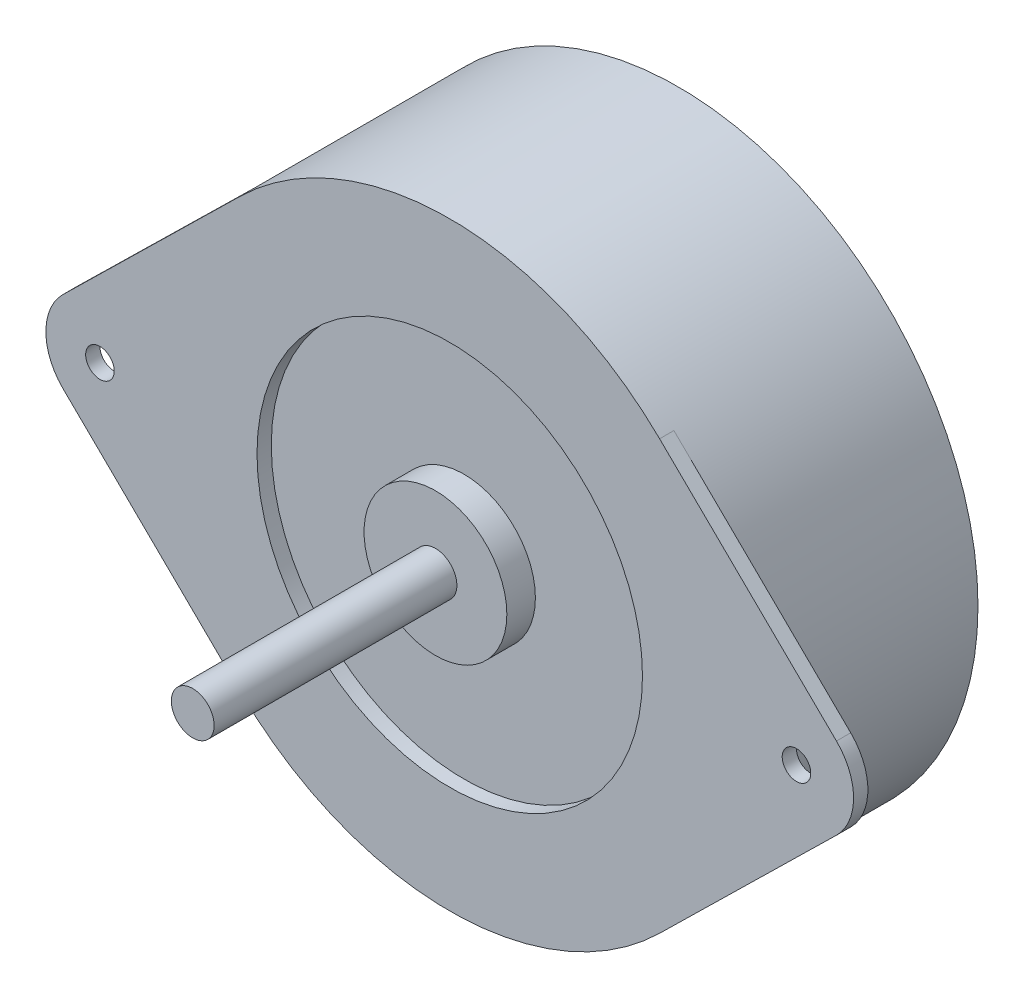
ISO-10303-21;
HEADER;
FILE_DESCRIPTION(('STEP AP214'),'2;1');
FILE_NAME('part.step','',(''),(''),'','','');
FILE_SCHEMA(('AUTOMOTIVE_DESIGN { 1 0 10303 214 1 1 1 1 }'));
ENDSEC;
DATA;
#1=APPLICATION_CONTEXT('core data for automotive mechanical design processes');
#2=APPLICATION_PROTOCOL_DEFINITION('international standard','automotive_design',2000,#1);
#3=PRODUCT_CONTEXT('',#1,'mechanical');
#4=PRODUCT('Part','Part','',(#3));
#5=PRODUCT_RELATED_PRODUCT_CATEGORY('part','',(#4));
#6=PRODUCT_DEFINITION_FORMATION('','',#4);
#7=PRODUCT_DEFINITION_CONTEXT('part definition',#1,'design');
#8=PRODUCT_DEFINITION('design','',#6,#7);
#9=PRODUCT_DEFINITION_SHAPE('','',#8);
#10=(LENGTH_UNIT() NAMED_UNIT(*) SI_UNIT(.MILLI.,.METRE.));
#11=(NAMED_UNIT(*) PLANE_ANGLE_UNIT() SI_UNIT($,.RADIAN.));
#12=(NAMED_UNIT(*) SI_UNIT($,.STERADIAN.) SOLID_ANGLE_UNIT());
#13=UNCERTAINTY_MEASURE_WITH_UNIT(LENGTH_MEASURE(1.E-05),#10,'distance_accuracy_value','');
#14=(GEOMETRIC_REPRESENTATION_CONTEXT(3) GLOBAL_UNCERTAINTY_ASSIGNED_CONTEXT((#13)) GLOBAL_UNIT_ASSIGNED_CONTEXT((#10,
#11,#12)) REPRESENTATION_CONTEXT('',''));
#15=CARTESIAN_POINT('',(0.,0.,0.));
#16=DIRECTION('',(0.,0.,1.));
#17=DIRECTION('',(1.,0.,0.));
#18=AXIS2_PLACEMENT_3D('',#15,#16,#17);
#19=CARTESIAN_POINT('',(0.,0.,2.));
#20=DIRECTION('',(0.,0.,1.));
#21=DIRECTION('',(1.,0.,0.));
#22=AXIS2_PLACEMENT_3D('',#19,#20,#21);
#23=PLANE('',#22);
#24=CARTESIAN_POINT('',(0.,0.,2.));
#25=DIRECTION('',(0.,0.,1.));
#26=DIRECTION('',(1.,0.,0.));
#27=AXIS2_PLACEMENT_3D('',#24,#25,#26);
#28=CIRCLE('',#27,5.);
#29=CARTESIAN_POINT('',(5.,0.,2.));
#30=VERTEX_POINT('',#29);
#31=EDGE_CURVE('E11',#30,#30,#28,.T.);
#32=ORIENTED_EDGE('',*,*,#31,.T.);
#33=EDGE_LOOP('',(#32));
#34=FACE_BOUND('',#33,.T.);
#35=CARTESIAN_POINT('',(0.,0.,2.));
#36=DIRECTION('',(0.,0.,1.));
#37=DIRECTION('',(1.,0.,0.));
#38=AXIS2_PLACEMENT_3D('',#35,#36,#37);
#39=CIRCLE('',#38,1.5);
#40=CARTESIAN_POINT('',(1.5,0.,2.));
#41=VERTEX_POINT('',#40);
#42=EDGE_CURVE('E147',#41,#41,#39,.T.);
#43=ORIENTED_EDGE('',*,*,#42,.F.);
#44=EDGE_LOOP('',(#43));
#45=FACE_BOUND('',#44,.T.);
#46=ADVANCED_FACE('F16',(#34,#45),#23,.T.);
#47=CARTESIAN_POINT('',(0.,0.,2.));
#48=DIRECTION('',(0.,0.,1.));
#49=DIRECTION('',(1.,0.,0.));
#50=AXIS2_PLACEMENT_3D('',#47,#48,#49);
#51=CYLINDRICAL_SURFACE('',#50,1.5);
#52=CARTESIAN_POINT('',(0.,0.,19.));
#53=DIRECTION('',(0.,0.,1.));
#54=DIRECTION('',(1.,0.,0.));
#55=AXIS2_PLACEMENT_3D('',#52,#53,#54);
#56=CIRCLE('',#55,1.5);
#57=CARTESIAN_POINT('',(1.5,0.,19.));
#58=VERTEX_POINT('',#57);
#59=EDGE_CURVE('E23',#58,#58,#56,.T.);
#60=ORIENTED_EDGE('',*,*,#59,.F.);
#61=EDGE_LOOP('',(#60));
#62=FACE_BOUND('',#61,.T.);
#63=ORIENTED_EDGE('',*,*,#42,.T.);
#64=EDGE_LOOP('',(#63));
#65=FACE_BOUND('',#64,.T.);
#66=ADVANCED_FACE('F163',(#62,#65),#51,.T.);
#67=CARTESIAN_POINT('',(0.,0.,0.));
#68=DIRECTION('',(0.,0.,1.));
#69=DIRECTION('',(1.,0.,0.));
#70=AXIS2_PLACEMENT_3D('',#67,#68,#69);
#71=CYLINDRICAL_SURFACE('',#70,5.);
#72=ORIENTED_EDGE('',*,*,#31,.F.);
#73=EDGE_LOOP('',(#72));
#74=FACE_BOUND('',#73,.T.);
#75=CARTESIAN_POINT('',(0.,0.,0.));
#76=DIRECTION('',(0.,0.,1.));
#77=DIRECTION('',(1.,0.,0.));
#78=AXIS2_PLACEMENT_3D('',#75,#76,#77);
#79=CIRCLE('',#78,5.);
#80=CARTESIAN_POINT('',(5.,0.,0.));
#81=VERTEX_POINT('',#80);
#82=EDGE_CURVE('E145',#81,#81,#79,.T.);
#83=ORIENTED_EDGE('',*,*,#82,.T.);
#84=EDGE_LOOP('',(#83));
#85=FACE_BOUND('',#84,.T.);
#86=ADVANCED_FACE('F153',(#74,#85),#71,.T.);
#87=CARTESIAN_POINT('',(0.,0.,19.));
#88=DIRECTION('',(0.,0.,1.));
#89=DIRECTION('',(1.,0.,0.));
#90=AXIS2_PLACEMENT_3D('',#87,#88,#89);
#91=PLANE('',#90);
#92=ORIENTED_EDGE('',*,*,#59,.T.);
#93=EDGE_LOOP('',(#92));
#94=FACE_BOUND('',#93,.T.);
#95=ADVANCED_FACE('F150',(#94),#91,.T.);
#96=CARTESIAN_POINT('',(0.,0.,0.));
#97=DIRECTION('',(0.,0.,1.));
#98=DIRECTION('',(1.,0.,0.));
#99=AXIS2_PLACEMENT_3D('',#96,#97,#98);
#100=PLANE('',#99);
#101=CARTESIAN_POINT('',(0.,0.,0.));
#102=DIRECTION('',(0.,0.,1.));
#103=DIRECTION('',(1.,0.,0.));
#104=AXIS2_PLACEMENT_3D('',#101,#102,#103);
#105=CIRCLE('',#104,13.5);
#106=CARTESIAN_POINT('',(13.5,0.,0.));
#107=VERTEX_POINT('',#106);
#108=EDGE_CURVE('E143',#107,#107,#105,.T.);
#109=ORIENTED_EDGE('',*,*,#108,.T.);
#110=EDGE_LOOP('',(#109));
#111=FACE_BOUND('',#110,.T.);
#112=ORIENTED_EDGE('',*,*,#82,.F.);
#113=EDGE_LOOP('',(#112));
#114=FACE_BOUND('',#113,.T.);
#115=ADVANCED_FACE('F152',(#111,#114),#100,.T.);
#116=CARTESIAN_POINT('',(0.,0.,0.));
#117=DIRECTION('',(0.,0.,1.));
#118=DIRECTION('',(1.,0.,0.));
#119=AXIS2_PLACEMENT_3D('',#116,#117,#118);
#120=CYLINDRICAL_SURFACE('',#119,13.5);
#121=CARTESIAN_POINT('',(0.,0.,1.));
#122=DIRECTION('',(0.,0.,1.));
#123=DIRECTION('',(1.,0.,0.));
#124=AXIS2_PLACEMENT_3D('',#121,#122,#123);
#125=CIRCLE('',#124,13.5);
#126=CARTESIAN_POINT('',(13.5,0.,1.));
#127=VERTEX_POINT('',#126);
#128=EDGE_CURVE('E141',#127,#127,#125,.T.);
#129=ORIENTED_EDGE('',*,*,#128,.T.);
#130=EDGE_LOOP('',(#129));
#131=FACE_BOUND('',#130,.T.);
#132=ORIENTED_EDGE('',*,*,#108,.F.);
#133=EDGE_LOOP('',(#132));
#134=FACE_BOUND('',#133,.T.);
#135=ADVANCED_FACE('F160',(#131,#134),#120,.F.);
#136=CARTESIAN_POINT('',(0.,0.,1.));
#137=DIRECTION('',(0.,0.,1.));
#138=DIRECTION('',(1.,0.,0.));
#139=AXIS2_PLACEMENT_3D('',#136,#137,#138);
#140=PLANE('',#139);
#141=DIRECTION('',(-0.714142842854285,0.7,0.));
#142=VECTOR('',#141,1.);
#143=CARTESIAN_POINT('',(27.0857142857143,2.85657137141714,1.));
#144=LINE('',#143,#142);
#145=CARTESIAN_POINT('',(27.0857142857143,2.85657137141714,1.));
#146=VERTEX_POINT('',#145);
#147=CARTESIAN_POINT('',(14.7,14.99699969994,1.));
#148=VERTEX_POINT('',#147);
#149=EDGE_CURVE('E139',#146,#148,#144,.T.);
#150=ORIENTED_EDGE('',*,*,#149,.T.);
#151=CARTESIAN_POINT('',(0.,0.,1.));
#152=DIRECTION('',(0.,0.,1.));
#153=DIRECTION('',(0.7,0.714142842854285,0.));
#154=AXIS2_PLACEMENT_3D('',#151,#152,#153);
#155=CIRCLE('',#154,21.);
#156=CARTESIAN_POINT('',(-14.7,14.99699969994,1.));
#157=VERTEX_POINT('',#156);
#158=EDGE_CURVE('E130',#148,#157,#155,.T.);
#159=ORIENTED_EDGE('',*,*,#158,.T.);
#160=DIRECTION('',(-0.714142842854285,-0.7,0.));
#161=VECTOR('',#160,1.);
#162=CARTESIAN_POINT('',(-14.7,14.99699969994,1.));
#163=LINE('',#162,#161);
#164=CARTESIAN_POINT('',(-27.0857142857143,2.85657137141714,1.));
#165=VERTEX_POINT('',#164);
#166=EDGE_CURVE('E134',#157,#165,#163,.T.);
#167=ORIENTED_EDGE('',*,*,#166,.T.);
#168=CARTESIAN_POINT('',(-24.2857142857143,0.,1.));
#169=DIRECTION('',(0.,0.,1.));
#170=DIRECTION('',(-0.7,0.714142842854285,0.));
#171=AXIS2_PLACEMENT_3D('',#168,#169,#170);
#172=CIRCLE('',#171,4.);
#173=CARTESIAN_POINT('',(-27.0857142857143,-2.85657137141714,1.));
#174=VERTEX_POINT('',#173);
#175=EDGE_CURVE('E448',#165,#174,#172,.T.);
#176=ORIENTED_EDGE('',*,*,#175,.T.);
#177=DIRECTION('',(0.714142842854285,-0.7,0.));
#178=VECTOR('',#177,1.);
#179=CARTESIAN_POINT('',(-27.0857142857143,-2.85657137141714,1.));
#180=LINE('',#179,#178);
#181=CARTESIAN_POINT('',(-14.7,-14.99699969994,1.));
#182=VERTEX_POINT('',#181);
#183=EDGE_CURVE('E431',#174,#182,#180,.T.);
#184=ORIENTED_EDGE('',*,*,#183,.T.);
#185=CARTESIAN_POINT('',(0.,0.,1.));
#186=DIRECTION('',(0.,0.,1.));
#187=DIRECTION('',(-0.700000000000001,-0.714142842854284,0.));
#188=AXIS2_PLACEMENT_3D('',#185,#186,#187);
#189=CIRCLE('',#188,21.);
#190=CARTESIAN_POINT('',(14.7,-14.99699969994,1.));
#191=VERTEX_POINT('',#190);
#192=EDGE_CURVE('E437',#182,#191,#189,.T.);
#193=ORIENTED_EDGE('',*,*,#192,.T.);
#194=DIRECTION('',(0.714142842854285,0.7,0.));
#195=VECTOR('',#194,1.);
#196=CARTESIAN_POINT('',(14.7,-14.99699969994,1.));
#197=LINE('',#196,#195);
#198=CARTESIAN_POINT('',(27.0857142857143,-2.85657137141714,1.));
#199=VERTEX_POINT('',#198);
#200=EDGE_CURVE('E416',#191,#199,#197,.T.);
#201=ORIENTED_EDGE('',*,*,#200,.T.);
#202=CARTESIAN_POINT('',(24.2857142857143,0.,1.));
#203=DIRECTION('',(0.,0.,1.));
#204=DIRECTION('',(0.7,-0.714142842854285,0.));
#205=AXIS2_PLACEMENT_3D('',#202,#203,#204);
#206=CIRCLE('',#205,4.);
#207=EDGE_CURVE('E407',#199,#146,#206,.T.);
#208=ORIENTED_EDGE('',*,*,#207,.T.);
#209=EDGE_LOOP('',(#150,#159,#167,#176,#184,#193,#201,#208));
#210=FACE_BOUND('',#209,.T.);
#211=ORIENTED_EDGE('',*,*,#128,.F.);
#212=EDGE_LOOP('',(#211));
#213=FACE_BOUND('',#212,.T.);
#214=CARTESIAN_POINT('',(24.2857142857143,0.,1.));
#215=DIRECTION('',(0.,0.,1.));
#216=DIRECTION('',(1.,0.,0.));
#217=AXIS2_PLACEMENT_3D('',#214,#215,#216);
#218=CIRCLE('',#217,1.);
#219=CARTESIAN_POINT('',(25.2857142857143,0.,1.));
#220=VERTEX_POINT('',#219);
#221=EDGE_CURVE('E456',#220,#220,#218,.T.);
#222=ORIENTED_EDGE('',*,*,#221,.F.);
#223=EDGE_LOOP('',(#222));
#224=FACE_BOUND('',#223,.T.);
#225=CARTESIAN_POINT('',(-24.5,0.,1.));
#226=DIRECTION('',(0.,0.,1.));
#227=DIRECTION('',(1.,0.,0.));
#228=AXIS2_PLACEMENT_3D('',#225,#226,#227);
#229=CIRCLE('',#228,1.);
#230=CARTESIAN_POINT('',(-23.5,0.,1.));
#231=VERTEX_POINT('',#230);
#232=EDGE_CURVE('E445',#231,#231,#229,.T.);
#233=ORIENTED_EDGE('',*,*,#232,.F.);
#234=EDGE_LOOP('',(#233));
#235=FACE_BOUND('',#234,.T.);
#236=ADVANCED_FACE('F304',(#210,#213,#224,#235),#140,.T.);
#237=CARTESIAN_POINT('',(27.0857142857143,2.85657137141714,0.));
#238=DIRECTION('',(0.7,0.714142842854285,0.));
#239=DIRECTION('',(-0.714142842854285,0.7,0.));
#240=AXIS2_PLACEMENT_3D('',#237,#238,#239);
#241=PLANE('',#240);
#242=DIRECTION('',(-0.714142842854285,0.7,0.));
#243=VECTOR('',#242,1.);
#244=CARTESIAN_POINT('',(27.0857142857143,2.85657137141714,0.));
#245=LINE('',#244,#243);
#246=CARTESIAN_POINT('',(27.0857142857143,2.85657137141714,0.));
#247=VERTEX_POINT('',#246);
#248=CARTESIAN_POINT('',(14.7,14.99699969994,0.));
#249=VERTEX_POINT('',#248);
#250=EDGE_CURVE('E132',#247,#249,#245,.T.);
#251=ORIENTED_EDGE('',*,*,#250,.T.);
#252=DIRECTION('',(0.,0.,1.));
#253=VECTOR('',#252,1.);
#254=CARTESIAN_POINT('',(14.7,14.99699969994,0.));
#255=LINE('',#254,#253);
#256=EDGE_CURVE('E119',#249,#148,#255,.T.);
#257=ORIENTED_EDGE('',*,*,#256,.T.);
#258=ORIENTED_EDGE('',*,*,#149,.F.);
#259=DIRECTION('',(0.,0.,1.));
#260=VECTOR('',#259,1.);
#261=CARTESIAN_POINT('',(27.0857142857143,2.85657137141714,0.));
#262=LINE('',#261,#260);
#263=EDGE_CURVE('E434',#247,#146,#262,.T.);
#264=ORIENTED_EDGE('',*,*,#263,.F.);
#265=EDGE_LOOP('',(#251,#257,#258,#264));
#266=FACE_BOUND('',#265,.T.);
#267=ADVANCED_FACE('F201',(#266),#241,.T.);
#268=CARTESIAN_POINT('',(0.,0.,-15.));
#269=DIRECTION('',(0.,0.,1.));
#270=DIRECTION('',(1.,0.,0.));
#271=AXIS2_PLACEMENT_3D('',#268,#269,#270);
#272=CYLINDRICAL_SURFACE('',#271,21.);
#273=CARTESIAN_POINT('',(0.,0.,0.));
#274=DIRECTION('',(0.,0.,1.));
#275=DIRECTION('',(0.7,-0.714142842854285,0.));
#276=AXIS2_PLACEMENT_3D('',#273,#274,#275);
#277=CIRCLE('',#276,21.);
#278=CARTESIAN_POINT('',(14.7,-14.99699969994,0.));
#279=VERTEX_POINT('',#278);
#280=CARTESIAN_POINT('',(21.,0.,0.));
#281=VERTEX_POINT('',#280);
#282=EDGE_CURVE('E115',#279,#281,#277,.T.);
#283=ORIENTED_EDGE('',*,*,#282,.F.);
#284=DIRECTION('',(0.,0.,1.));
#285=VECTOR('',#284,1.);
#286=CARTESIAN_POINT('',(14.7,-14.99699969994,0.));
#287=LINE('',#286,#285);
#288=EDGE_CURVE('E452',#279,#191,#287,.T.);
#289=ORIENTED_EDGE('',*,*,#288,.T.);
#290=ORIENTED_EDGE('',*,*,#192,.F.);
#291=DIRECTION('',(0.,0.,1.));
#292=VECTOR('',#291,1.);
#293=CARTESIAN_POINT('',(-14.7,-14.99699969994,0.));
#294=LINE('',#293,#292);
#295=CARTESIAN_POINT('',(-14.7,-14.99699969994,0.));
#296=VERTEX_POINT('',#295);
#297=EDGE_CURVE('E423',#296,#182,#294,.T.);
#298=ORIENTED_EDGE('',*,*,#297,.F.);
#299=CARTESIAN_POINT('',(0.,0.,0.));
#300=DIRECTION('',(0.,0.,1.));
#301=DIRECTION('',(-0.7,0.714142842854285,0.));
#302=AXIS2_PLACEMENT_3D('',#299,#300,#301);
#303=CIRCLE('',#302,21.);
#304=CARTESIAN_POINT('',(-14.7,14.99699969994,0.));
#305=VERTEX_POINT('',#304);
#306=EDGE_CURVE('E400',#305,#296,#303,.T.);
#307=ORIENTED_EDGE('',*,*,#306,.F.);
#308=DIRECTION('',(0.,0.,1.));
#309=VECTOR('',#308,1.);
#310=CARTESIAN_POINT('',(-14.7,14.99699969994,0.));
#311=LINE('',#310,#309);
#312=EDGE_CURVE('E419',#305,#157,#311,.T.);
#313=ORIENTED_EDGE('',*,*,#312,.T.);
#314=ORIENTED_EDGE('',*,*,#158,.F.);
#315=ORIENTED_EDGE('',*,*,#256,.F.);
#316=CARTESIAN_POINT('',(0.,0.,0.));
#317=DIRECTION('',(0.,0.,1.));
#318=DIRECTION('',(1.,0.,0.));
#319=AXIS2_PLACEMENT_3D('',#316,#317,#318);
#320=CIRCLE('',#319,21.);
#321=EDGE_CURVE('E111',#281,#249,#320,.T.);
#322=ORIENTED_EDGE('',*,*,#321,.F.);
#323=EDGE_LOOP('',(#283,#289,#290,#298,#307,#313,#314,#315,#322));
#324=FACE_BOUND('',#323,.T.);
#325=CARTESIAN_POINT('',(0.,0.,-15.));
#326=DIRECTION('',(0.,0.,1.));
#327=DIRECTION('',(1.,0.,0.));
#328=AXIS2_PLACEMENT_3D('',#325,#326,#327);
#329=CIRCLE('',#328,21.);
#330=CARTESIAN_POINT('',(21.,0.,-15.));
#331=VERTEX_POINT('',#330);
#332=EDGE_CURVE('E450',#331,#331,#329,.T.);
#333=ORIENTED_EDGE('',*,*,#332,.T.);
#334=EDGE_LOOP('',(#333));
#335=FACE_BOUND('',#334,.T.);
#336=ADVANCED_FACE('F113',(#324,#335),#272,.T.);
#337=CARTESIAN_POINT('',(-14.7,14.99699969994,0.));
#338=DIRECTION('',(-0.7,0.714142842854285,0.));
#339=DIRECTION('',(-0.714142842854285,-0.7,0.));
#340=AXIS2_PLACEMENT_3D('',#337,#338,#339);
#341=PLANE('',#340);
#342=DIRECTION('',(-0.714142842854285,-0.7,0.));
#343=VECTOR('',#342,1.);
#344=CARTESIAN_POINT('',(-14.7,14.99699969994,0.));
#345=LINE('',#344,#343);
#346=CARTESIAN_POINT('',(-27.0857142857143,2.85657137141714,0.));
#347=VERTEX_POINT('',#346);
#348=EDGE_CURVE('E454',#305,#347,#345,.T.);
#349=ORIENTED_EDGE('',*,*,#348,.T.);
#350=DIRECTION('',(0.,0.,1.));
#351=VECTOR('',#350,1.);
#352=CARTESIAN_POINT('',(-27.0857142857143,2.85657137141714,0.));
#353=LINE('',#352,#351);
#354=EDGE_CURVE('E440',#347,#165,#353,.T.);
#355=ORIENTED_EDGE('',*,*,#354,.T.);
#356=ORIENTED_EDGE('',*,*,#166,.F.);
#357=ORIENTED_EDGE('',*,*,#312,.F.);
#358=EDGE_LOOP('',(#349,#355,#356,#357));
#359=FACE_BOUND('',#358,.T.);
#360=ADVANCED_FACE('F200',(#359),#341,.T.);
#361=CARTESIAN_POINT('',(-24.2857142857143,0.,0.));
#362=DIRECTION('',(0.,0.,1.));
#363=DIRECTION('',(-0.7,0.714142842854285,0.));
#364=AXIS2_PLACEMENT_3D('',#361,#362,#363);
#365=CYLINDRICAL_SURFACE('',#364,4.);
#366=CARTESIAN_POINT('',(-24.2857142857143,0.,0.));
#367=DIRECTION('',(0.,0.,1.));
#368=DIRECTION('',(-0.7,0.714142842854285,0.));
#369=AXIS2_PLACEMENT_3D('',#366,#367,#368);
#370=CIRCLE('',#369,4.);
#371=CARTESIAN_POINT('',(-27.0857142857143,-2.85657137141714,0.));
#372=VERTEX_POINT('',#371);
#373=EDGE_CURVE('E443',#347,#372,#370,.T.);
#374=ORIENTED_EDGE('',*,*,#373,.T.);
#375=DIRECTION('',(0.,0.,1.));
#376=VECTOR('',#375,1.);
#377=CARTESIAN_POINT('',(-27.0857142857143,-2.85657137141714,0.));
#378=LINE('',#377,#376);
#379=EDGE_CURVE('E426',#372,#174,#378,.T.);
#380=ORIENTED_EDGE('',*,*,#379,.T.);
#381=ORIENTED_EDGE('',*,*,#175,.F.);
#382=ORIENTED_EDGE('',*,*,#354,.F.);
#383=EDGE_LOOP('',(#374,#380,#381,#382));
#384=FACE_BOUND('',#383,.T.);
#385=ADVANCED_FACE('F268',(#384),#365,.T.);
#386=CARTESIAN_POINT('',(-27.0857142857143,-2.85657137141714,0.));
#387=DIRECTION('',(-0.7,-0.714142842854285,0.));
#388=DIRECTION('',(0.714142842854285,-0.7,0.));
#389=AXIS2_PLACEMENT_3D('',#386,#387,#388);
#390=PLANE('',#389);
#391=DIRECTION('',(0.714142842854285,-0.7,0.));
#392=VECTOR('',#391,1.);
#393=CARTESIAN_POINT('',(-27.0857142857143,-2.85657137141714,0.));
#394=LINE('',#393,#392);
#395=EDGE_CURVE('E429',#372,#296,#394,.T.);
#396=ORIENTED_EDGE('',*,*,#395,.T.);
#397=ORIENTED_EDGE('',*,*,#297,.T.);
#398=ORIENTED_EDGE('',*,*,#183,.F.);
#399=ORIENTED_EDGE('',*,*,#379,.F.);
#400=EDGE_LOOP('',(#396,#397,#398,#399));
#401=FACE_BOUND('',#400,.T.);
#402=ADVANCED_FACE('F259',(#401),#390,.T.);
#403=CARTESIAN_POINT('',(14.7,-14.99699969994,0.));
#404=DIRECTION('',(0.7,-0.714142842854285,0.));
#405=DIRECTION('',(0.714142842854285,0.7,0.));
#406=AXIS2_PLACEMENT_3D('',#403,#404,#405);
#407=PLANE('',#406);
#408=DIRECTION('',(0.714142842854285,0.7,0.));
#409=VECTOR('',#408,1.);
#410=CARTESIAN_POINT('',(14.7,-14.99699969994,0.));
#411=LINE('',#410,#409);
#412=CARTESIAN_POINT('',(27.0857142857143,-2.85657137141714,0.));
#413=VERTEX_POINT('',#412);
#414=EDGE_CURVE('E129',#279,#413,#411,.T.);
#415=ORIENTED_EDGE('',*,*,#414,.T.);
#416=DIRECTION('',(0.,0.,1.));
#417=VECTOR('',#416,1.);
#418=CARTESIAN_POINT('',(27.0857142857143,-2.85657137141714,0.));
#419=LINE('',#418,#417);
#420=EDGE_CURVE('E410',#413,#199,#419,.T.);
#421=ORIENTED_EDGE('',*,*,#420,.T.);
#422=ORIENTED_EDGE('',*,*,#200,.F.);
#423=ORIENTED_EDGE('',*,*,#288,.F.);
#424=EDGE_LOOP('',(#415,#421,#422,#423));
#425=FACE_BOUND('',#424,.T.);
#426=ADVANCED_FACE('F250',(#425),#407,.T.);
#427=CARTESIAN_POINT('',(24.2857142857143,0.,0.));
#428=DIRECTION('',(0.,0.,1.));
#429=DIRECTION('',(0.7,-0.714142842854285,0.));
#430=AXIS2_PLACEMENT_3D('',#427,#428,#429);
#431=CYLINDRICAL_SURFACE('',#430,4.);
#432=CARTESIAN_POINT('',(24.2857142857143,0.,0.));
#433=DIRECTION('',(0.,0.,1.));
#434=DIRECTION('',(0.7,-0.714142842854285,0.));
#435=AXIS2_PLACEMENT_3D('',#432,#433,#434);
#436=CIRCLE('',#435,4.);
#437=EDGE_CURVE('E413',#413,#247,#436,.T.);
#438=ORIENTED_EDGE('',*,*,#437,.T.);
#439=ORIENTED_EDGE('',*,*,#263,.T.);
#440=ORIENTED_EDGE('',*,*,#207,.F.);
#441=ORIENTED_EDGE('',*,*,#420,.F.);
#442=EDGE_LOOP('',(#438,#439,#440,#441));
#443=FACE_BOUND('',#442,.T.);
#444=ADVANCED_FACE('F238',(#443),#431,.T.);
#445=CARTESIAN_POINT('',(24.2857142857143,0.,0.));
#446=DIRECTION('',(0.,0.,1.));
#447=DIRECTION('',(1.,0.,0.));
#448=AXIS2_PLACEMENT_3D('',#445,#446,#447);
#449=CYLINDRICAL_SURFACE('',#448,1.);
#450=ORIENTED_EDGE('',*,*,#221,.T.);
#451=EDGE_LOOP('',(#450));
#452=FACE_BOUND('',#451,.T.);
#453=CARTESIAN_POINT('',(24.2857142857143,0.,0.));
#454=DIRECTION('',(0.,0.,1.));
#455=DIRECTION('',(1.,0.,0.));
#456=AXIS2_PLACEMENT_3D('',#453,#454,#455);
#457=CIRCLE('',#456,1.);
#458=CARTESIAN_POINT('',(25.2857142857143,0.,0.));
#459=VERTEX_POINT('',#458);
#460=EDGE_CURVE('E122',#459,#459,#457,.T.);
#461=ORIENTED_EDGE('',*,*,#460,.F.);
#462=EDGE_LOOP('',(#461));
#463=FACE_BOUND('',#462,.T.);
#464=ADVANCED_FACE('F231',(#452,#463),#449,.F.);
#465=CARTESIAN_POINT('',(-24.5,0.,0.));
#466=DIRECTION('',(0.,0.,1.));
#467=DIRECTION('',(1.,0.,0.));
#468=AXIS2_PLACEMENT_3D('',#465,#466,#467);
#469=CYLINDRICAL_SURFACE('',#468,1.);
#470=ORIENTED_EDGE('',*,*,#232,.T.);
#471=EDGE_LOOP('',(#470));
#472=FACE_BOUND('',#471,.T.);
#473=CARTESIAN_POINT('',(-24.5,0.,0.));
#474=DIRECTION('',(0.,0.,1.));
#475=DIRECTION('',(1.,0.,0.));
#476=AXIS2_PLACEMENT_3D('',#473,#474,#475);
#477=CIRCLE('',#476,1.);
#478=CARTESIAN_POINT('',(-23.5,0.,0.));
#479=VERTEX_POINT('',#478);
#480=EDGE_CURVE('E123',#479,#479,#477,.T.);
#481=ORIENTED_EDGE('',*,*,#480,.F.);
#482=EDGE_LOOP('',(#481));
#483=FACE_BOUND('',#482,.T.);
#484=ADVANCED_FACE('F227',(#472,#483),#469,.F.);
#485=CARTESIAN_POINT('',(0.,0.,0.));
#486=DIRECTION('',(0.,0.,1.));
#487=DIRECTION('',(1.,0.,0.));
#488=AXIS2_PLACEMENT_3D('',#485,#486,#487);
#489=PLANE('',#488);
#490=ORIENTED_EDGE('',*,*,#321,.T.);
#491=ORIENTED_EDGE('',*,*,#250,.F.);
#492=ORIENTED_EDGE('',*,*,#437,.F.);
#493=ORIENTED_EDGE('',*,*,#414,.F.);
#494=ORIENTED_EDGE('',*,*,#282,.T.);
#495=EDGE_LOOP('',(#490,#491,#492,#493,#494));
#496=FACE_BOUND('',#495,.T.);
#497=ORIENTED_EDGE('',*,*,#460,.T.);
#498=EDGE_LOOP('',(#497));
#499=FACE_BOUND('',#498,.T.);
#500=ADVANCED_FACE('F126',(#496,#499),#489,.F.);
#501=CARTESIAN_POINT('',(0.,0.,-15.));
#502=DIRECTION('',(0.,0.,1.));
#503=DIRECTION('',(1.,0.,0.));
#504=AXIS2_PLACEMENT_3D('',#501,#502,#503);
#505=PLANE('',#504);
#506=ORIENTED_EDGE('',*,*,#332,.F.);
#507=EDGE_LOOP('',(#506));
#508=FACE_BOUND('',#507,.T.);
#509=ADVANCED_FACE('F211',(#508),#505,.F.);
#510=CARTESIAN_POINT('',(0.,0.,0.));
#511=DIRECTION('',(0.,0.,1.));
#512=DIRECTION('',(1.,0.,0.));
#513=AXIS2_PLACEMENT_3D('',#510,#511,#512);
#514=PLANE('',#513);
#515=ORIENTED_EDGE('',*,*,#306,.T.);
#516=ORIENTED_EDGE('',*,*,#395,.F.);
#517=ORIENTED_EDGE('',*,*,#373,.F.);
#518=ORIENTED_EDGE('',*,*,#348,.F.);
#519=EDGE_LOOP('',(#515,#516,#517,#518));
#520=FACE_BOUND('',#519,.T.);
#521=ORIENTED_EDGE('',*,*,#480,.T.);
#522=EDGE_LOOP('',(#521));
#523=FACE_BOUND('',#522,.T.);
#524=ADVANCED_FACE('F216',(#520,#523),#514,.F.);
#525=CLOSED_SHELL('',(#46,#66,#86,#95,#115,#135,#236,#267,#336,#360,#385,#402,#426,#444,#464,
#484,#500,#509,#524));
#526=MANIFOLD_SOLID_BREP('B1',#525);
#527=ADVANCED_BREP_SHAPE_REPRESENTATION('',(#18,#526),#14);
#528=SHAPE_DEFINITION_REPRESENTATION(#9,#527);
ENDSEC;
END-ISO-10303-21;
